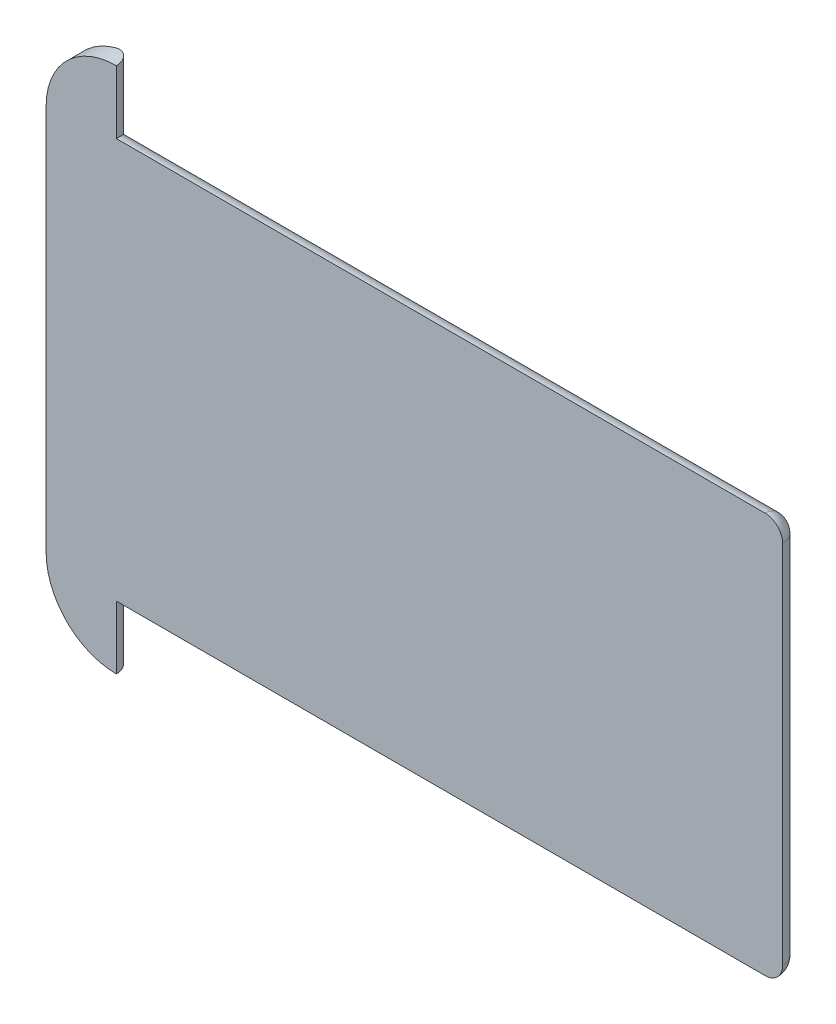
ISO-10303-21;
HEADER;
FILE_DESCRIPTION(('STEP AP214'),'2;1');
FILE_NAME('part.step','',(''),(''),'','','');
FILE_SCHEMA(('AUTOMOTIVE_DESIGN { 1 0 10303 214 1 1 1 1 }'));
ENDSEC;
DATA;
#1=APPLICATION_CONTEXT('core data for automotive mechanical design processes');
#2=APPLICATION_PROTOCOL_DEFINITION('international standard','automotive_design',2000,#1);
#3=PRODUCT_CONTEXT('',#1,'mechanical');
#4=PRODUCT('Part','Part','',(#3));
#5=PRODUCT_RELATED_PRODUCT_CATEGORY('part','',(#4));
#6=PRODUCT_DEFINITION_FORMATION('','',#4);
#7=PRODUCT_DEFINITION_CONTEXT('part definition',#1,'design');
#8=PRODUCT_DEFINITION('design','',#6,#7);
#9=PRODUCT_DEFINITION_SHAPE('','',#8);
#10=(LENGTH_UNIT() NAMED_UNIT(*) SI_UNIT(.MILLI.,.METRE.));
#11=(NAMED_UNIT(*) PLANE_ANGLE_UNIT() SI_UNIT($,.RADIAN.));
#12=(NAMED_UNIT(*) SI_UNIT($,.STERADIAN.) SOLID_ANGLE_UNIT());
#13=UNCERTAINTY_MEASURE_WITH_UNIT(LENGTH_MEASURE(1.E-05),#10,'distance_accuracy_value','');
#14=(GEOMETRIC_REPRESENTATION_CONTEXT(3) GLOBAL_UNCERTAINTY_ASSIGNED_CONTEXT((#13)) GLOBAL_UNIT_ASSIGNED_CONTEXT((#10,
#11,#12)) REPRESENTATION_CONTEXT('',''));
#15=CARTESIAN_POINT('',(0.,0.,0.));
#16=DIRECTION('',(0.,0.,1.));
#17=DIRECTION('',(1.,0.,0.));
#18=AXIS2_PLACEMENT_3D('',#15,#16,#17);
#19=CARTESIAN_POINT('',(-108.310248072362,92.3066188083274,5.));
#20=DIRECTION('',(0.,0.,-1.));
#21=DIRECTION('',(-1.,0.,0.));
#22=AXIS2_PLACEMENT_3D('',#19,#20,#21);
#23=CYLINDRICAL_SURFACE('',#22,20.);
#24=CARTESIAN_POINT('',(-108.310248072362,92.3066188083274,5.));
#25=DIRECTION('',(0.,0.,1.));
#26=DIRECTION('',(1.,0.,0.));
#27=AXIS2_PLACEMENT_3D('',#24,#25,#26);
#28=CIRCLE('',#27,20.);
#29=CARTESIAN_POINT('',(-108.310248072362,112.306618808327,5.));
#30=VERTEX_POINT('',#29);
#31=CARTESIAN_POINT('',(-128.310248072362,92.3066188083274,5.));
#32=VERTEX_POINT('',#31);
#33=EDGE_CURVE('E307',#30,#32,#28,.T.);
#34=ORIENTED_EDGE('',*,*,#33,.F.);
#35=CARTESIAN_POINT('',(-108.310248072362,112.306618808327,5.));
#36=CARTESIAN_POINT('',(-108.310232987454,112.306607660933,4.85945671434246));
#37=CARTESIAN_POINT('',(-108.316173164302,112.306618458209,4.71891558702845));
#38=CARTESIAN_POINT('',(-108.339855119004,112.306603377183,4.43883727436571));
#39=CARTESIAN_POINT('',(-108.357596361818,112.306577500544,4.29930004379191));
#40=CARTESIAN_POINT('',(-108.404756294615,112.306408574985,4.02230579555489));
#41=CARTESIAN_POINT('',(-108.434167427582,112.306265601831,3.88484749133399));
#42=CARTESIAN_POINT('',(-108.504453260873,112.305706954579,3.61289599715953));
#43=CARTESIAN_POINT('',(-108.545327820707,112.305291283823,3.47840277088904));
#44=CARTESIAN_POINT('',(-108.638266974038,112.303982635293,3.2132905756228));
#45=CARTESIAN_POINT('',(-108.690335366352,112.303089495327,3.08267293904216));
#46=CARTESIAN_POINT('',(-108.805302787154,112.300573556247,2.82624326292196));
#47=CARTESIAN_POINT('',(-108.868205805363,112.298950487988,2.7004330145723));
#48=CARTESIAN_POINT('',(-109.004340908177,112.294686943791,2.45463347145731));
#49=CARTESIAN_POINT('',(-109.077567626526,112.292046995199,2.33464119578701));
#50=CARTESIAN_POINT('',(-109.233869296908,112.285433630475,2.10122950492006));
#51=CARTESIAN_POINT('',(-109.316947641643,112.281459754097,1.98781237420879));
#52=CARTESIAN_POINT('',(-109.492075620915,112.271862353334,1.76871971416385));
#53=CARTESIAN_POINT('',(-109.584099741682,112.266243433546,1.6630235913417));
#54=CARTESIAN_POINT('',(-109.776623540183,112.25302324189,1.45978963064299));
#55=CARTESIAN_POINT('',(-109.877123124501,112.245421991869,1.36225170287186));
#56=CARTESIAN_POINT('',(-110.085848319559,112.227919223156,1.17602162963654));
#57=CARTESIAN_POINT('',(-110.194074962997,112.218017396599,1.08733067035589));
#58=CARTESIAN_POINT('',(-110.417364146479,112.195626929755,0.919470123450683));
#59=CARTESIAN_POINT('',(-110.532424193223,112.183139228889,0.840297094528037));
#60=CARTESIAN_POINT('',(-110.767292486627,112.155466815916,0.692749028016371));
#61=CARTESIAN_POINT('',(-110.887039449453,112.140311278649,0.624270950948425));
#62=CARTESIAN_POINT('',(-111.131403450767,112.107029971461,0.497603912739045));
#63=CARTESIAN_POINT('',(-111.256018709218,112.088905279578,0.439411233067821));
#64=CARTESIAN_POINT('',(-111.509213144952,112.049542305641,0.33362083325722));
#65=CARTESIAN_POINT('',(-111.637792734631,112.028303698787,0.28602421965409));
#66=CARTESIAN_POINT('',(-111.89785943123,111.982657420561,0.201681755215036));
#67=CARTESIAN_POINT('',(-112.029345972612,111.958250361176,0.164933813427611));
#68=CARTESIAN_POINT('',(-112.351264670461,111.895067777504,0.0889747954397296));
#69=CARTESIAN_POINT('',(-112.542764593413,111.854622643432,0.055481481769419));
#70=CARTESIAN_POINT('',(-112.830599314272,111.789332602409,0.0221212193530651));
#71=CARTESIAN_POINT('',(-112.926579084946,111.766815008619,0.0138143443130585));
#72=CARTESIAN_POINT('',(-113.118508380336,111.720283728857,0.00275413894913899));
#73=CARTESIAN_POINT('',(-113.21445790026,111.696269869886,1.45203810802861E-06));
#74=CARTESIAN_POINT('',(-113.310248072362,111.671535539364,0.));
#75=B_SPLINE_CURVE_WITH_KNOTS('',3,(#35,#36,#37,#38,#39,#40,#41,#42,#43,#44,#45,#46,#47,#48,#49,
#50,#51,#52,#53,#54,#55,#56,#57,#58,#59,#60,#61,#62,#63,#64,#65,#66,#67,#68,#69,#70,#71,#72,#73,
#74),.UNSPECIFIED.,.F.,.F.,(4,2,2,2,2,2,2,2,2,2,2,2,2,2,2,2,2,2,2,4),(0.,0.42150133700849,
0.842983565165106,1.2641933003289,1.6853978735545,2.10674561599715,2.52824884775269,
2.94953378461562,3.37096422722935,3.79122615271093,4.21148344674622,4.6317970125003,
5.05195814990225,5.46778155877129,5.88345432409409,6.2991704773539,6.7148064539175,
7.30891204354583,7.6055792203185,7.90228076188445),.UNSPECIFIED.);
#76=CARTESIAN_POINT('',(-113.310248072362,111.671535539364,0.));
#77=VERTEX_POINT('',#76);
#78=EDGE_CURVE('E142',#30,#77,#75,.T.);
#79=ORIENTED_EDGE('',*,*,#78,.T.);
#80=CARTESIAN_POINT('',(-108.310248072362,92.3066188083274,0.));
#81=DIRECTION('',(0.,0.,1.));
#82=DIRECTION('',(1.,0.,0.));
#83=AXIS2_PLACEMENT_3D('',#80,#81,#82);
#84=CIRCLE('',#83,20.);
#85=CARTESIAN_POINT('',(-128.310248072362,92.3066188083274,0.));
#86=VERTEX_POINT('',#85);
#87=EDGE_CURVE('E141',#77,#86,#84,.T.);
#88=ORIENTED_EDGE('',*,*,#87,.T.);
#89=DIRECTION('',(0.,0.,-1.));
#90=VECTOR('',#89,1.);
#91=CARTESIAN_POINT('',(-128.310248072362,92.3066188083274,5.));
#92=LINE('',#91,#90);
#93=EDGE_CURVE('E188',#32,#86,#92,.T.);
#94=ORIENTED_EDGE('',*,*,#93,.F.);
#95=EDGE_LOOP('',(#34,#79,#88,#94));
#96=FACE_BOUND('',#95,.T.);
#97=ADVANCED_FACE('F37',(#96),#23,.T.);
#98=CARTESIAN_POINT('',(-128.310248072362,92.3066188083274,5.));
#99=DIRECTION('',(1.,0.,0.));
#100=DIRECTION('',(0.,1.,0.));
#101=AXIS2_PLACEMENT_3D('',#98,#99,#100);
#102=PLANE('',#101);
#103=DIRECTION('',(0.,-1.,0.));
#104=VECTOR('',#103,1.);
#105=CARTESIAN_POINT('',(-128.310248072362,92.3066188083274,0.));
#106=LINE('',#105,#104);
#107=CARTESIAN_POINT('',(-128.310248072362,-17.6933811916726,0.));
#108=VERTEX_POINT('',#107);
#109=EDGE_CURVE('E285',#86,#108,#106,.T.);
#110=ORIENTED_EDGE('',*,*,#109,.T.);
#111=DIRECTION('',(0.,0.,-1.));
#112=VECTOR('',#111,1.);
#113=CARTESIAN_POINT('',(-128.310248072362,-17.6933811916726,5.));
#114=LINE('',#113,#112);
#115=CARTESIAN_POINT('',(-128.310248072362,-17.6933811916726,5.));
#116=VERTEX_POINT('',#115);
#117=EDGE_CURVE('E288',#116,#108,#114,.T.);
#118=ORIENTED_EDGE('',*,*,#117,.F.);
#119=DIRECTION('',(0.,-1.,0.));
#120=VECTOR('',#119,1.);
#121=CARTESIAN_POINT('',(-128.310248072362,92.3066188083274,5.));
#122=LINE('',#121,#120);
#123=EDGE_CURVE('E305',#32,#116,#122,.T.);
#124=ORIENTED_EDGE('',*,*,#123,.F.);
#125=ORIENTED_EDGE('',*,*,#93,.T.);
#126=EDGE_LOOP('',(#110,#118,#124,#125));
#127=FACE_BOUND('',#126,.T.);
#128=ADVANCED_FACE('F158',(#127),#102,.F.);
#129=CARTESIAN_POINT('',(-108.310248072362,-17.6933811916726,5.));
#130=DIRECTION('',(0.,0.,-1.));
#131=DIRECTION('',(-1.,0.,0.));
#132=AXIS2_PLACEMENT_3D('',#129,#130,#131);
#133=CYLINDRICAL_SURFACE('',#132,20.);
#134=CARTESIAN_POINT('',(-108.310248072362,-17.6933811916726,0.));
#135=DIRECTION('',(0.,0.,1.));
#136=DIRECTION('',(1.,0.,0.));
#137=AXIS2_PLACEMENT_3D('',#134,#135,#136);
#138=CIRCLE('',#137,20.);
#139=CARTESIAN_POINT('',(-113.310248072362,-37.0582979227097,0.));
#140=VERTEX_POINT('',#139);
#141=EDGE_CURVE('E119',#108,#140,#138,.T.);
#142=ORIENTED_EDGE('',*,*,#141,.T.);
#143=CARTESIAN_POINT('',(-113.310248072362,-37.0582979227097,0.));
#144=CARTESIAN_POINT('',(-113.174489371557,-37.0933651107661,-1.59011717497088E-05));
#145=CARTESIAN_POINT('',(-113.038343746728,-37.1269809382234,0.0055288151947933));
#146=CARTESIAN_POINT('',(-112.766231057997,-37.1911659455932,0.0278131512875881));
#147=CARTESIAN_POINT('',(-112.630264023469,-37.2217346743588,0.0445544259318718));
#148=CARTESIAN_POINT('',(-112.359540726902,-37.279662737862,0.0892991342257006));
#149=CARTESIAN_POINT('',(-112.224784126627,-37.3070229966535,0.117299314919578));
#150=CARTESIAN_POINT('',(-111.95746976144,-37.3584845274556,0.18450628103583));
#151=CARTESIAN_POINT('',(-111.82491183336,-37.3825860422611,0.223712230886425));
#152=CARTESIAN_POINT('',(-111.562839043211,-37.4275737522173,0.313235509652669));
#153=CARTESIAN_POINT('',(-111.433328430454,-37.4484556597049,0.363567442132439));
#154=CARTESIAN_POINT('',(-111.178509733641,-37.4870591794487,0.475064690743545));
#155=CARTESIAN_POINT('',(-111.053203236748,-37.504779608827,0.53623404474446));
#156=CARTESIAN_POINT('',(-110.807949599835,-37.5371907230899,0.668957754417751));
#157=CARTESIAN_POINT('',(-110.687997899788,-37.5518840259079,0.740503044692974));
#158=CARTESIAN_POINT('',(-110.454246325806,-37.578479028465,0.893568679674232));
#159=CARTESIAN_POINT('',(-110.340448734504,-37.5903796977744,0.97509268951211));
#160=CARTESIAN_POINT('',(-110.12175826353,-37.6114710428554,1.14610790798412));
#161=CARTESIAN_POINT('',(-110.016749926056,-37.6207029740659,1.23544647120715));
#162=CARTESIAN_POINT('',(-109.814344726807,-37.6370019266584,1.42261731381365));
#163=CARTESIAN_POINT('',(-109.716950669985,-37.6440681530099,1.52045269550623));
#164=CARTESIAN_POINT('',(-109.530539692201,-37.6563372787511,1.72389887294258));
#165=CARTESIAN_POINT('',(-109.44152227691,-37.6615402881457,1.82950920920661));
#166=CARTESIAN_POINT('',(-109.2724707631,-37.6704004119124,2.04781093161464));
#167=CARTESIAN_POINT('',(-109.19243992478,-37.6740569665757,2.16050486460579));
#168=CARTESIAN_POINT('',(-109.041498684978,-37.6801522162271,2.39287660227107));
#169=CARTESIAN_POINT('',(-108.970648239948,-37.6825831782941,2.51259355897671));
#170=CARTESIAN_POINT('',(-108.839133910892,-37.6864952810262,2.75757357683025));
#171=CARTESIAN_POINT('',(-108.77847424861,-37.687976028758,2.8828389094869));
#172=CARTESIAN_POINT('',(-108.667845137798,-37.6902606455897,3.13790477463661));
#173=CARTESIAN_POINT('',(-108.617867669897,-37.6910650237965,3.26770181929944));
#174=CARTESIAN_POINT('',(-108.528887737201,-37.6922353495784,3.53101149490733));
#175=CARTESIAN_POINT('',(-108.489887641167,-37.6926012025814,3.66452492097515));
#176=CARTESIAN_POINT('',(-108.40798146268,-37.6932028266766,3.99571638593522));
#177=CARTESIAN_POINT('',(-108.371344069577,-37.6933040816093,4.1949996318837));
#178=CARTESIAN_POINT('',(-108.334698271104,-37.6933693337838,4.49588663203049));
#179=CARTESIAN_POINT('',(-108.325534728519,-37.6933766596954,4.59647099060896));
#180=CARTESIAN_POINT('',(-108.313309914963,-37.693381515266,4.79802648714293));
#181=CARTESIAN_POINT('',(-108.310249645418,-37.6933790433175,4.89899768584847));
#182=CARTESIAN_POINT('',(-108.310248072362,-37.6933811916726,5.));
#183=B_SPLINE_CURVE_WITH_KNOTS('',3,(#143,#144,#145,#146,#147,#148,#149,#150,#151,#152,#153,
#154,#155,#156,#157,#158,#159,#160,#161,#162,#163,#164,#165,#166,#167,#168,#169,#170,#171,#172,
#173,#174,#175,#176,#177,#178,#179,#180,#181,#182),.UNSPECIFIED.,.F.,.F.,(4,2,2,2,2,2,2,2,2,2,2,
2,2,2,2,2,2,2,2,4),(0.,0.420543487049875,0.841149146674344,1.26163337091419,1.68208624941363,
2.10309431119879,2.52425956576453,2.94505904297826,3.36601354406867,3.78006215029118,
4.19426257225211,4.60843853565685,5.02276427387312,5.43967248593691,5.85675298729511,
6.27351926827165,6.69037541268801,7.29653006440958,7.59937888742951,7.90227739781462),.UNSPECIFIED.);
#184=CARTESIAN_POINT('',(-108.310248072362,-37.6933811916726,5.));
#185=VERTEX_POINT('',#184);
#186=EDGE_CURVE('E46',#140,#185,#183,.T.);
#187=ORIENTED_EDGE('',*,*,#186,.T.);
#188=CARTESIAN_POINT('',(-108.310248072362,-17.6933811916726,5.));
#189=DIRECTION('',(0.,0.,1.));
#190=DIRECTION('',(1.,0.,0.));
#191=AXIS2_PLACEMENT_3D('',#188,#189,#190);
#192=CIRCLE('',#191,20.);
#193=EDGE_CURVE('E294',#116,#185,#192,.T.);
#194=ORIENTED_EDGE('',*,*,#193,.F.);
#195=ORIENTED_EDGE('',*,*,#117,.T.);
#196=EDGE_LOOP('',(#142,#187,#194,#195));
#197=FACE_BOUND('',#196,.T.);
#198=ADVANCED_FACE('F202',(#197),#133,.T.);
#199=CARTESIAN_POINT('',(76.3990524048815,-14.7137550610194,5.));
#200=DIRECTION('',(0.,0.,1.));
#201=DIRECTION('',(1.,0.,0.));
#202=AXIS2_PLACEMENT_3D('',#199,#200,#201);
#203=PLANE('',#202);
#204=CARTESIAN_POINT('',(76.3990524048815,-14.7137550610194,5.));
#205=DIRECTION('',(0.,0.,1.));
#206=DIRECTION('',(1.,0.,0.));
#207=AXIS2_PLACEMENT_3D('',#204,#205,#206);
#208=CIRCLE('',#207,5.);
#209=CARTESIAN_POINT('',(76.3990524048815,-19.7137550610194,5.));
#210=VERTEX_POINT('',#209);
#211=CARTESIAN_POINT('',(81.3990524048815,-14.7137550610193,5.));
#212=VERTEX_POINT('',#211);
#213=EDGE_CURVE('E108',#210,#212,#208,.T.);
#214=ORIENTED_EDGE('',*,*,#213,.T.);
#215=DIRECTION('',(0.,1.,0.));
#216=VECTOR('',#215,1.);
#217=CARTESIAN_POINT('',(81.3990524048815,89.3269926776741,5.));
#218=LINE('',#217,#216);
#219=CARTESIAN_POINT('',(81.3990524048815,89.3269926776741,5.));
#220=VERTEX_POINT('',#219);
#221=EDGE_CURVE('E111',#212,#220,#218,.T.);
#222=ORIENTED_EDGE('',*,*,#221,.T.);
#223=CARTESIAN_POINT('',(76.3990524048815,89.3269926776741,5.));
#224=DIRECTION('',(0.,0.,1.));
#225=DIRECTION('',(-1.,0.,0.));
#226=AXIS2_PLACEMENT_3D('',#223,#224,#225);
#227=CIRCLE('',#226,5.);
#228=CARTESIAN_POINT('',(76.3990524048815,94.3269926776741,5.));
#229=VERTEX_POINT('',#228);
#230=EDGE_CURVE('E129',#220,#229,#227,.T.);
#231=ORIENTED_EDGE('',*,*,#230,.T.);
#232=DIRECTION('',(-1.,0.,0.));
#233=VECTOR('',#232,1.);
#234=CARTESIAN_POINT('',(-108.310248072362,94.3269926776741,5.));
#235=LINE('',#234,#233);
#236=CARTESIAN_POINT('',(-108.310248072362,94.3269926776741,5.));
#237=VERTEX_POINT('',#236);
#238=EDGE_CURVE('E310',#229,#237,#235,.T.);
#239=ORIENTED_EDGE('',*,*,#238,.T.);
#240=DIRECTION('',(0.,1.,0.));
#241=VECTOR('',#240,1.);
#242=CARTESIAN_POINT('',(-108.310248072362,112.306618808327,5.));
#243=LINE('',#242,#241);
#244=EDGE_CURVE('E196',#237,#30,#243,.T.);
#245=ORIENTED_EDGE('',*,*,#244,.T.);
#246=ORIENTED_EDGE('',*,*,#33,.T.);
#247=ORIENTED_EDGE('',*,*,#123,.T.);
#248=ORIENTED_EDGE('',*,*,#193,.T.);
#249=DIRECTION('',(0.,1.,0.));
#250=VECTOR('',#249,1.);
#251=CARTESIAN_POINT('',(-108.310248072362,-37.6933811916726,5.));
#252=LINE('',#251,#250);
#253=CARTESIAN_POINT('',(-108.310248072362,-19.7137550610194,5.));
#254=VERTEX_POINT('',#253);
#255=EDGE_CURVE('E302',#185,#254,#252,.T.);
#256=ORIENTED_EDGE('',*,*,#255,.T.);
#257=DIRECTION('',(1.,0.,0.));
#258=VECTOR('',#257,1.);
#259=CARTESIAN_POINT('',(-108.310248072362,-19.7137550610194,5.));
#260=LINE('',#259,#258);
#261=EDGE_CURVE('E115',#254,#210,#260,.T.);
#262=ORIENTED_EDGE('',*,*,#261,.T.);
#263=EDGE_LOOP('',(#214,#222,#231,#239,#245,#246,#247,#248,#256,#262));
#264=FACE_BOUND('',#263,.T.);
#265=ADVANCED_FACE('F110',(#264),#203,.T.);
#266=CARTESIAN_POINT('',(76.3990524048815,-14.7137550610194,0.));
#267=DIRECTION('',(0.,0.,1.));
#268=DIRECTION('',(1.,0.,0.));
#269=AXIS2_PLACEMENT_3D('',#266,#267,#268);
#270=PLANE('',#269);
#271=DIRECTION('',(1.,0.,0.));
#272=VECTOR('',#271,1.);
#273=CARTESIAN_POINT('',(76.3990524048815,-14.7137550610194,0.));
#274=LINE('',#273,#272);
#275=CARTESIAN_POINT('',(76.3990524048815,-14.7137550610194,0.));
#276=VERTEX_POINT('',#275);
#277=CARTESIAN_POINT('',(-113.310248072362,-14.7137550610194,0.));
#278=VERTEX_POINT('',#277);
#279=EDGE_CURVE('E53',#276,#278,#274,.F.);
#280=ORIENTED_EDGE('',*,*,#279,.T.);
#281=DIRECTION('',(0.,1.,0.));
#282=VECTOR('',#281,1.);
#283=CARTESIAN_POINT('',(-113.310248072362,-14.7137550610194,0.));
#284=LINE('',#283,#282);
#285=EDGE_CURVE('E57',#278,#140,#284,.F.);
#286=ORIENTED_EDGE('',*,*,#285,.T.);
#287=ORIENTED_EDGE('',*,*,#141,.F.);
#288=ORIENTED_EDGE('',*,*,#109,.F.);
#289=ORIENTED_EDGE('',*,*,#87,.F.);
#290=DIRECTION('',(0.,1.,0.));
#291=VECTOR('',#290,1.);
#292=CARTESIAN_POINT('',(-113.310248072362,-14.7137550610194,0.));
#293=LINE('',#292,#291);
#294=CARTESIAN_POINT('',(-113.310248072362,89.3269926776741,0.));
#295=VERTEX_POINT('',#294);
#296=EDGE_CURVE('E149',#77,#295,#293,.F.);
#297=ORIENTED_EDGE('',*,*,#296,.T.);
#298=DIRECTION('',(-1.,0.,0.));
#299=VECTOR('',#298,1.);
#300=CARTESIAN_POINT('',(76.3990524048815,89.3269926776741,0.));
#301=LINE('',#300,#299);
#302=CARTESIAN_POINT('',(76.3990524048815,89.3269926776741,0.));
#303=VERTEX_POINT('',#302);
#304=EDGE_CURVE('E181',#295,#303,#301,.F.);
#305=ORIENTED_EDGE('',*,*,#304,.T.);
#306=DIRECTION('',(0.,1.,0.));
#307=VECTOR('',#306,1.);
#308=CARTESIAN_POINT('',(76.3990524048815,-14.7137550610194,0.));
#309=LINE('',#308,#307);
#310=EDGE_CURVE('E187',#303,#276,#309,.F.);
#311=ORIENTED_EDGE('',*,*,#310,.T.);
#312=EDGE_LOOP('',(#280,#286,#287,#288,#289,#297,#305,#311));
#313=FACE_BOUND('',#312,.T.);
#314=ADVANCED_FACE('F174',(#313),#270,.F.);
#315=CARTESIAN_POINT('',(-108.310248072362,89.3269926776741,5.));
#316=DIRECTION('',(-1.,0.,0.));
#317=DIRECTION('',(0.,0.,1.));
#318=AXIS2_PLACEMENT_3D('',#315,#316,#317);
#319=CYLINDRICAL_SURFACE('',#318,5.);
#320=ORIENTED_EDGE('',*,*,#304,.F.);
#321=CARTESIAN_POINT('',(-113.310248072362,89.3269926776741,5.));
#322=DIRECTION('',(-0.707106781186547,0.707106781186547,0.));
#323=DIRECTION('',(0.707106781186547,0.707106781186547,0.));
#324=AXIS2_PLACEMENT_3D('',#321,#322,#323);
#325=ELLIPSE('',#324,7.07106781186547,5.);
#326=EDGE_CURVE('E185',#295,#237,#325,.F.);
#327=ORIENTED_EDGE('',*,*,#326,.T.);
#328=ORIENTED_EDGE('',*,*,#238,.F.);
#329=CARTESIAN_POINT('',(76.3990524048815,89.3269926776741,5.));
#330=DIRECTION('',(1.,0.,0.));
#331=DIRECTION('',(0.,1.,0.));
#332=AXIS2_PLACEMENT_3D('',#329,#330,#331);
#333=CIRCLE('',#332,5.);
#334=EDGE_CURVE('E134',#303,#229,#333,.T.);
#335=ORIENTED_EDGE('',*,*,#334,.F.);
#336=EDGE_LOOP('',(#320,#327,#328,#335));
#337=FACE_BOUND('',#336,.T.);
#338=ADVANCED_FACE('F171',(#337),#319,.T.);
#339=CARTESIAN_POINT('',(76.3990524048815,89.3269926776741,5.));
#340=DIRECTION('',(0.,0.,1.));
#341=DIRECTION('',(1.,0.,0.));
#342=AXIS2_PLACEMENT_3D('',#339,#340,#341);
#343=SPHERICAL_SURFACE('',#342,5.);
#344=ORIENTED_EDGE('',*,*,#334,.T.);
#345=ORIENTED_EDGE('',*,*,#230,.F.);
#346=CARTESIAN_POINT('',(76.3990524048815,89.3269926776741,5.));
#347=DIRECTION('',(0.,-1.,0.));
#348=DIRECTION('',(1.,0.,0.));
#349=AXIS2_PLACEMENT_3D('',#346,#347,#348);
#350=CIRCLE('',#349,5.);
#351=EDGE_CURVE('E128',#303,#220,#350,.T.);
#352=ORIENTED_EDGE('',*,*,#351,.F.);
#353=EDGE_LOOP('',(#344,#345,#352));
#354=FACE_BOUND('',#353,.T.);
#355=ADVANCED_FACE('F169',(#354),#343,.T.);
#356=CARTESIAN_POINT('',(76.3990524048815,89.3269926776741,5.));
#357=DIRECTION('',(0.,1.,0.));
#358=DIRECTION('',(0.,0.,1.));
#359=AXIS2_PLACEMENT_3D('',#356,#357,#358);
#360=CYLINDRICAL_SURFACE('',#359,5.);
#361=ORIENTED_EDGE('',*,*,#351,.T.);
#362=ORIENTED_EDGE('',*,*,#221,.F.);
#363=CARTESIAN_POINT('',(76.3990524048815,-14.7137550610194,5.));
#364=DIRECTION('',(0.,-1.,0.));
#365=DIRECTION('',(1.,0.,0.));
#366=AXIS2_PLACEMENT_3D('',#363,#364,#365);
#367=CIRCLE('',#366,5.);
#368=EDGE_CURVE('E126',#276,#212,#367,.T.);
#369=ORIENTED_EDGE('',*,*,#368,.F.);
#370=ORIENTED_EDGE('',*,*,#310,.F.);
#371=EDGE_LOOP('',(#361,#362,#369,#370));
#372=FACE_BOUND('',#371,.T.);
#373=ADVANCED_FACE('F124',(#372),#360,.T.);
#374=CARTESIAN_POINT('',(76.3990524048815,-14.7137550610194,5.));
#375=DIRECTION('',(0.,0.,1.));
#376=DIRECTION('',(1.,0.,0.));
#377=AXIS2_PLACEMENT_3D('',#374,#375,#376);
#378=SPHERICAL_SURFACE('',#377,5.);
#379=ORIENTED_EDGE('',*,*,#368,.T.);
#380=ORIENTED_EDGE('',*,*,#213,.F.);
#381=CARTESIAN_POINT('',(76.3990524048815,-14.7137550610194,5.));
#382=DIRECTION('',(-1.,0.,0.));
#383=DIRECTION('',(0.,-1.,0.));
#384=AXIS2_PLACEMENT_3D('',#381,#382,#383);
#385=CIRCLE('',#384,5.);
#386=EDGE_CURVE('E132',#276,#210,#385,.T.);
#387=ORIENTED_EDGE('',*,*,#386,.F.);
#388=EDGE_LOOP('',(#379,#380,#387));
#389=FACE_BOUND('',#388,.T.);
#390=ADVANCED_FACE('F131',(#389),#378,.T.);
#391=CARTESIAN_POINT('',(-108.310248072362,-14.7137550610194,5.));
#392=DIRECTION('',(1.,0.,0.));
#393=DIRECTION('',(0.,0.,-1.));
#394=AXIS2_PLACEMENT_3D('',#391,#392,#393);
#395=CYLINDRICAL_SURFACE('',#394,5.);
#396=ORIENTED_EDGE('',*,*,#261,.F.);
#397=CARTESIAN_POINT('',(-113.310248072362,-14.7137550610194,5.));
#398=DIRECTION('',(0.707106781186547,0.707106781186547,0.));
#399=DIRECTION('',(-0.707106781186547,0.707106781186547,0.));
#400=AXIS2_PLACEMENT_3D('',#397,#398,#399);
#401=ELLIPSE('',#400,7.07106781186547,5.);
#402=EDGE_CURVE('E11',#254,#278,#401,.T.);
#403=ORIENTED_EDGE('',*,*,#402,.T.);
#404=ORIENTED_EDGE('',*,*,#279,.F.);
#405=ORIENTED_EDGE('',*,*,#386,.T.);
#406=EDGE_LOOP('',(#396,#403,#404,#405));
#407=FACE_BOUND('',#406,.T.);
#408=ADVANCED_FACE('F161',(#407),#395,.T.);
#409=CARTESIAN_POINT('',(-113.310248072362,112.306618808327,5.));
#410=DIRECTION('',(0.,1.,0.));
#411=DIRECTION('',(0.,0.,1.));
#412=AXIS2_PLACEMENT_3D('',#409,#410,#411);
#413=CYLINDRICAL_SURFACE('',#412,5.);
#414=ORIENTED_EDGE('',*,*,#326,.F.);
#415=ORIENTED_EDGE('',*,*,#296,.F.);
#416=ORIENTED_EDGE('',*,*,#78,.F.);
#417=ORIENTED_EDGE('',*,*,#244,.F.);
#418=EDGE_LOOP('',(#414,#415,#416,#417));
#419=FACE_BOUND('',#418,.T.);
#420=ADVANCED_FACE('F151',(#419),#413,.T.);
#421=CARTESIAN_POINT('',(-113.310248072362,-37.6933811916726,5.));
#422=DIRECTION('',(0.,1.,0.));
#423=DIRECTION('',(0.,0.,1.));
#424=AXIS2_PLACEMENT_3D('',#421,#422,#423);
#425=CYLINDRICAL_SURFACE('',#424,5.);
#426=ORIENTED_EDGE('',*,*,#186,.F.);
#427=ORIENTED_EDGE('',*,*,#285,.F.);
#428=ORIENTED_EDGE('',*,*,#402,.F.);
#429=ORIENTED_EDGE('',*,*,#255,.F.);
#430=EDGE_LOOP('',(#426,#427,#428,#429));
#431=FACE_BOUND('',#430,.T.);
#432=ADVANCED_FACE('F39',(#431),#425,.T.);
#433=CLOSED_SHELL('',(#97,#128,#198,#265,#314,#338,#355,#373,#390,#408,#420,#432));
#434=MANIFOLD_SOLID_BREP('B2',#433);
#435=ADVANCED_BREP_SHAPE_REPRESENTATION('',(#18,#434),#14);
#436=SHAPE_DEFINITION_REPRESENTATION(#9,#435);
ENDSEC;
END-ISO-10303-21;
